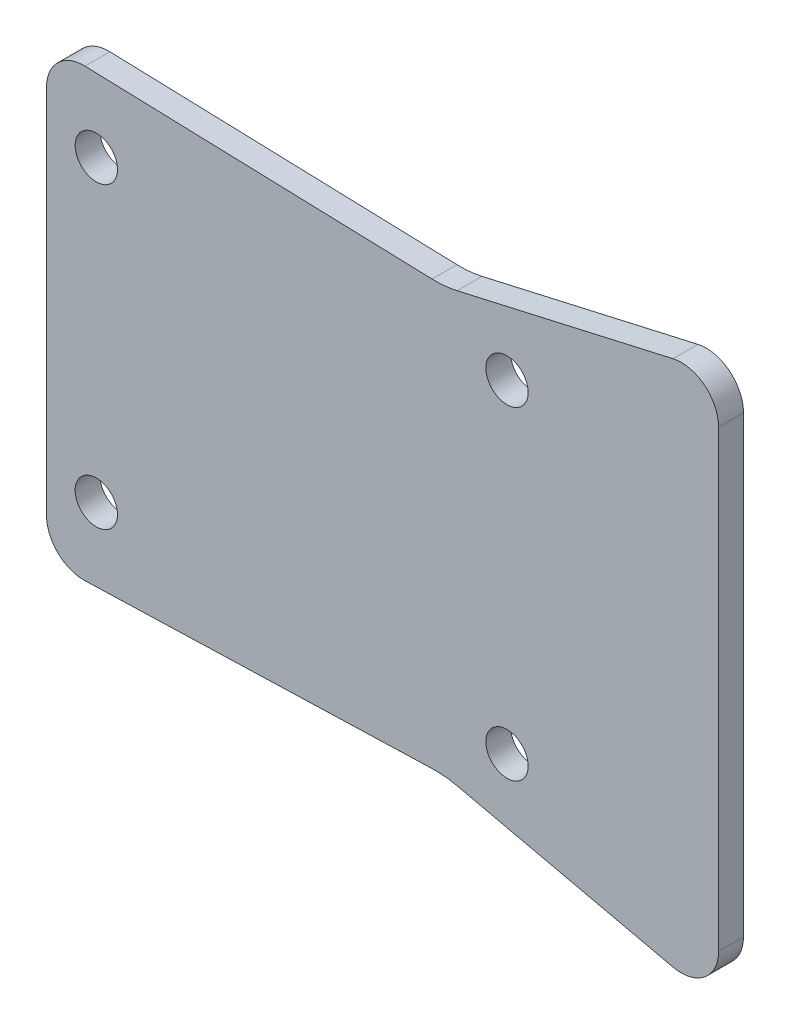
ISO-10303-21;
HEADER;
FILE_DESCRIPTION(('STEP AP214'),'2;1');
FILE_NAME('part.step','',(''),(''),'','','');
FILE_SCHEMA(('AUTOMOTIVE_DESIGN { 1 0 10303 214 1 1 1 1 }'));
ENDSEC;
DATA;
#1=APPLICATION_CONTEXT('core data for automotive mechanical design processes');
#2=APPLICATION_PROTOCOL_DEFINITION('international standard','automotive_design',2000,#1);
#3=PRODUCT_CONTEXT('',#1,'mechanical');
#4=PRODUCT('Part','Part','',(#3));
#5=PRODUCT_RELATED_PRODUCT_CATEGORY('part','',(#4));
#6=PRODUCT_DEFINITION_FORMATION('','',#4);
#7=PRODUCT_DEFINITION_CONTEXT('part definition',#1,'design');
#8=PRODUCT_DEFINITION('design','',#6,#7);
#9=PRODUCT_DEFINITION_SHAPE('','',#8);
#10=(LENGTH_UNIT() NAMED_UNIT(*) SI_UNIT(.MILLI.,.METRE.));
#11=(NAMED_UNIT(*) PLANE_ANGLE_UNIT() SI_UNIT($,.RADIAN.));
#12=(NAMED_UNIT(*) SI_UNIT($,.STERADIAN.) SOLID_ANGLE_UNIT());
#13=UNCERTAINTY_MEASURE_WITH_UNIT(LENGTH_MEASURE(1.E-05),#10,'distance_accuracy_value','');
#14=(GEOMETRIC_REPRESENTATION_CONTEXT(3) GLOBAL_UNCERTAINTY_ASSIGNED_CONTEXT((#13)) GLOBAL_UNIT_ASSIGNED_CONTEXT((#10,
#11,#12)) REPRESENTATION_CONTEXT('',''));
#15=CARTESIAN_POINT('',(0.,0.,0.));
#16=DIRECTION('',(0.,0.,1.));
#17=DIRECTION('',(1.,0.,0.));
#18=AXIS2_PLACEMENT_3D('',#15,#16,#17);
#19=CARTESIAN_POINT('',(41.,-14.9047855137033,2.));
#20=DIRECTION('',(0.,0.,-1.));
#21=DIRECTION('',(-1.,0.,0.));
#22=AXIS2_PLACEMENT_3D('',#19,#20,#21);
#23=CYLINDRICAL_SURFACE('',#22,3.00000000000001);
#24=CARTESIAN_POINT('',(41.,-14.9047855137033,0.));
#25=DIRECTION('',(0.,0.,1.));
#26=DIRECTION('',(1.,0.,0.));
#27=AXIS2_PLACEMENT_3D('',#24,#25,#26);
#28=CIRCLE('',#27,3.00000000000001);
#29=CARTESIAN_POINT('',(38.,-14.9047855137034,0.));
#30=VERTEX_POINT('',#29);
#31=CARTESIAN_POINT('',(41.0937042571332,-17.9033217419646,0.));
#32=VERTEX_POINT('',#31);
#33=EDGE_CURVE('E161',#30,#32,#28,.T.);
#34=ORIENTED_EDGE('',*,*,#33,.T.);
#35=DIRECTION('',(0.,0.,-1.));
#36=VECTOR('',#35,1.);
#37=CARTESIAN_POINT('',(41.0937042571332,-17.9033217419646,2.));
#38=LINE('',#37,#36);
#39=CARTESIAN_POINT('',(41.0937042571332,-17.9033217419646,2.));
#40=VERTEX_POINT('',#39);
#41=EDGE_CURVE('E11',#40,#32,#38,.T.);
#42=ORIENTED_EDGE('',*,*,#41,.F.);
#43=CARTESIAN_POINT('',(41.,-14.9047855137033,2.));
#44=DIRECTION('',(0.,0.,1.));
#45=DIRECTION('',(1.,0.,0.));
#46=AXIS2_PLACEMENT_3D('',#43,#44,#45);
#47=CIRCLE('',#46,3.00000000000001);
#48=CARTESIAN_POINT('',(38.,-14.9047855137034,2.));
#49=VERTEX_POINT('',#48);
#50=EDGE_CURVE('E184',#49,#40,#47,.T.);
#51=ORIENTED_EDGE('',*,*,#50,.F.);
#52=DIRECTION('',(0.,0.,-1.));
#53=VECTOR('',#52,1.);
#54=CARTESIAN_POINT('',(38.,-14.9047855137034,2.));
#55=LINE('',#54,#53);
#56=EDGE_CURVE('E157',#49,#30,#55,.T.);
#57=ORIENTED_EDGE('',*,*,#56,.T.);
#58=EDGE_LOOP('',(#34,#42,#51,#57));
#59=FACE_BOUND('',#58,.T.);
#60=ADVANCED_FACE('F41',(#59),#23,.T.);
#61=CARTESIAN_POINT('',(41.0937042571332,-17.9033217419646,2.));
#62=DIRECTION('',(-0.0312347523777213,0.999512076087079,0.));
#63=DIRECTION('',(-0.999512076087079,-0.0312347523777213,0.));
#64=AXIS2_PLACEMENT_3D('',#61,#62,#63);
#65=PLANE('',#64);
#66=DIRECTION('',(0.999512076087079,0.0312347523777213,0.));
#67=VECTOR('',#66,1.);
#68=CARTESIAN_POINT('',(41.0937042571332,-17.9033217419646,0.));
#69=LINE('',#68,#67);
#70=CARTESIAN_POINT('',(68.9760894124591,-17.0319972058607,0.));
#71=VERTEX_POINT('',#70);
#72=EDGE_CURVE('E164',#32,#71,#69,.T.);
#73=ORIENTED_EDGE('',*,*,#72,.T.);
#74=DIRECTION('',(0.,0.,-1.));
#75=VECTOR('',#74,1.);
#76=CARTESIAN_POINT('',(68.9760894124591,-17.0319972058607,2.));
#77=LINE('',#76,#75);
#78=CARTESIAN_POINT('',(68.9760894124591,-17.0319972058607,2.));
#79=VERTEX_POINT('',#78);
#80=EDGE_CURVE('E49',#79,#71,#77,.T.);
#81=ORIENTED_EDGE('',*,*,#80,.F.);
#82=DIRECTION('',(0.999512076087079,0.0312347523777213,0.));
#83=VECTOR('',#82,1.);
#84=CARTESIAN_POINT('',(41.0937042571332,-17.9033217419646,2.));
#85=LINE('',#84,#83);
#86=EDGE_CURVE('E112',#40,#79,#85,.T.);
#87=ORIENTED_EDGE('',*,*,#86,.F.);
#88=ORIENTED_EDGE('',*,*,#41,.T.);
#89=EDGE_LOOP('',(#73,#81,#87,#88));
#90=FACE_BOUND('',#89,.T.);
#91=ADVANCED_FACE('F263',(#90),#65,.F.);
#92=CARTESIAN_POINT('',(69.2259674314809,-25.0280938145575,2.));
#93=DIRECTION('',(0.,0.,-1.));
#94=DIRECTION('',(-1.,0.,0.));
#95=AXIS2_PLACEMENT_3D('',#92,#93,#94);
#96=CYLINDRICAL_SURFACE('',#95,8.0000000000002);
#97=CARTESIAN_POINT('',(69.2259674314809,-25.0280938145575,0.));
#98=DIRECTION('',(0.,0.,-1.));
#99=DIRECTION('',(-1.,0.,0.));
#100=AXIS2_PLACEMENT_3D('',#97,#98,#99);
#101=CIRCLE('',#100,8.0000000000002);
#102=CARTESIAN_POINT('',(70.9989362601927,-17.2270309682256,0.));
#103=VERTEX_POINT('',#102);
#104=EDGE_CURVE('E167',#71,#103,#101,.T.);
#105=ORIENTED_EDGE('',*,*,#104,.T.);
#106=DIRECTION('',(0.,0.,-1.));
#107=VECTOR('',#106,1.);
#108=CARTESIAN_POINT('',(70.9989362601927,-17.2270309682256,2.));
#109=LINE('',#108,#107);
#110=CARTESIAN_POINT('',(70.9989362601927,-17.2270309682256,2.));
#111=VERTEX_POINT('',#110);
#112=EDGE_CURVE('E203',#111,#103,#109,.T.);
#113=ORIENTED_EDGE('',*,*,#112,.F.);
#114=CARTESIAN_POINT('',(69.2259674314809,-25.0280938145575,2.));
#115=DIRECTION('',(0.,0.,-1.));
#116=DIRECTION('',(-1.,0.,0.));
#117=AXIS2_PLACEMENT_3D('',#114,#115,#116);
#118=CIRCLE('',#117,8.0000000000002);
#119=EDGE_CURVE('E211',#79,#111,#118,.T.);
#120=ORIENTED_EDGE('',*,*,#119,.F.);
#121=ORIENTED_EDGE('',*,*,#80,.T.);
#122=EDGE_LOOP('',(#105,#113,#120,#121));
#123=FACE_BOUND('',#122,.T.);
#124=ADVANCED_FACE('F209',(#123),#96,.F.);
#125=CARTESIAN_POINT('',(70.9989362601927,-17.2270309682256,2.));
#126=DIRECTION('',(0.221621103588968,0.97513285579146,0.));
#127=DIRECTION('',(-0.97513285579146,0.221621103588968,0.));
#128=AXIS2_PLACEMENT_3D('',#125,#126,#127);
#129=PLANE('',#128);
#130=DIRECTION('',(0.97513285579146,-0.221621103588968,0.));
#131=VECTOR('',#130,1.);
#132=CARTESIAN_POINT('',(70.9989362601927,-17.2270309682256,0.));
#133=LINE('',#132,#131);
#134=CARTESIAN_POINT('',(88.3351366892331,-21.1670765202802,0.));
#135=VERTEX_POINT('',#134);
#136=EDGE_CURVE('E169',#103,#135,#133,.T.);
#137=ORIENTED_EDGE('',*,*,#136,.T.);
#138=DIRECTION('',(0.,0.,-1.));
#139=VECTOR('',#138,1.);
#140=CARTESIAN_POINT('',(88.3351366892331,-21.1670765202802,2.));
#141=LINE('',#140,#139);
#142=CARTESIAN_POINT('',(88.3351366892331,-21.1670765202802,2.));
#143=VERTEX_POINT('',#142);
#144=EDGE_CURVE('E200',#143,#135,#141,.T.);
#145=ORIENTED_EDGE('',*,*,#144,.F.);
#146=DIRECTION('',(0.97513285579146,-0.221621103588968,0.));
#147=VECTOR('',#146,1.);
#148=CARTESIAN_POINT('',(70.9989362601927,-17.2270309682256,2.));
#149=LINE('',#148,#147);
#150=EDGE_CURVE('E229',#111,#143,#149,.T.);
#151=ORIENTED_EDGE('',*,*,#150,.F.);
#152=ORIENTED_EDGE('',*,*,#112,.T.);
#153=EDGE_LOOP('',(#137,#145,#151,#152));
#154=FACE_BOUND('',#153,.T.);
#155=ADVANCED_FACE('F220',(#154),#129,.F.);
#156=CARTESIAN_POINT('',(89.,-18.2416779529059,2.));
#157=DIRECTION('',(0.,0.,-1.));
#158=DIRECTION('',(-1.,0.,0.));
#159=AXIS2_PLACEMENT_3D('',#156,#157,#158);
#160=CYLINDRICAL_SURFACE('',#159,2.99999999999999);
#161=CARTESIAN_POINT('',(89.,-18.2416779529059,0.));
#162=DIRECTION('',(0.,0.,1.));
#163=DIRECTION('',(1.,0.,0.));
#164=AXIS2_PLACEMENT_3D('',#161,#162,#163);
#165=CIRCLE('',#164,2.99999999999999);
#166=CARTESIAN_POINT('',(92.,-18.2416779529059,0.));
#167=VERTEX_POINT('',#166);
#168=EDGE_CURVE('E171',#135,#167,#165,.T.);
#169=ORIENTED_EDGE('',*,*,#168,.T.);
#170=DIRECTION('',(0.,0.,-1.));
#171=VECTOR('',#170,1.);
#172=CARTESIAN_POINT('',(92.,-18.2416779529059,2.));
#173=LINE('',#172,#171);
#174=CARTESIAN_POINT('',(92.,-18.2416779529059,2.));
#175=VERTEX_POINT('',#174);
#176=EDGE_CURVE('E197',#175,#167,#173,.T.);
#177=ORIENTED_EDGE('',*,*,#176,.F.);
#178=CARTESIAN_POINT('',(89.,-18.2416779529059,2.));
#179=DIRECTION('',(0.,0.,1.));
#180=DIRECTION('',(1.,0.,0.));
#181=AXIS2_PLACEMENT_3D('',#178,#179,#180);
#182=CIRCLE('',#181,2.99999999999999);
#183=EDGE_CURVE('E226',#143,#175,#182,.T.);
#184=ORIENTED_EDGE('',*,*,#183,.F.);
#185=ORIENTED_EDGE('',*,*,#144,.T.);
#186=EDGE_LOOP('',(#169,#177,#184,#185));
#187=FACE_BOUND('',#186,.T.);
#188=ADVANCED_FACE('F224',(#187),#160,.T.);
#189=CARTESIAN_POINT('',(92.,-18.2416779529059,2.));
#190=DIRECTION('',(-1.,0.,0.));
#191=DIRECTION('',(0.,0.,1.));
#192=AXIS2_PLACEMENT_3D('',#189,#190,#191);
#193=PLANE('',#192);
#194=DIRECTION('',(0.,1.,0.));
#195=VECTOR('',#194,1.);
#196=CARTESIAN_POINT('',(92.,-18.2416779529059,0.));
#197=LINE('',#196,#195);
#198=CARTESIAN_POINT('',(92.,18.2416779529059,0.));
#199=VERTEX_POINT('',#198);
#200=EDGE_CURVE('E173',#167,#199,#197,.T.);
#201=ORIENTED_EDGE('',*,*,#200,.T.);
#202=DIRECTION('',(0.,0.,-1.));
#203=VECTOR('',#202,1.);
#204=CARTESIAN_POINT('',(92.,18.2416779529059,2.));
#205=LINE('',#204,#203);
#206=CARTESIAN_POINT('',(92.,18.2416779529059,2.));
#207=VERTEX_POINT('',#206);
#208=EDGE_CURVE('E194',#207,#199,#205,.T.);
#209=ORIENTED_EDGE('',*,*,#208,.F.);
#210=DIRECTION('',(0.,1.,0.));
#211=VECTOR('',#210,1.);
#212=CARTESIAN_POINT('',(92.,-18.2416779529059,2.));
#213=LINE('',#212,#211);
#214=EDGE_CURVE('E228',#175,#207,#213,.T.);
#215=ORIENTED_EDGE('',*,*,#214,.F.);
#216=ORIENTED_EDGE('',*,*,#176,.T.);
#217=EDGE_LOOP('',(#201,#209,#215,#216));
#218=FACE_BOUND('',#217,.T.);
#219=ADVANCED_FACE('F276',(#218),#193,.F.);
#220=CARTESIAN_POINT('',(89.,18.2416779529059,2.));
#221=DIRECTION('',(0.,0.,-1.));
#222=DIRECTION('',(-1.,0.,0.));
#223=AXIS2_PLACEMENT_3D('',#220,#221,#222);
#224=CYLINDRICAL_SURFACE('',#223,2.99999999999999);
#225=CARTESIAN_POINT('',(89.,18.2416779529059,0.));
#226=DIRECTION('',(0.,0.,1.));
#227=DIRECTION('',(1.,0.,0.));
#228=AXIS2_PLACEMENT_3D('',#225,#226,#227);
#229=CIRCLE('',#228,2.99999999999999);
#230=CARTESIAN_POINT('',(88.3351366892331,21.1670765202802,0.));
#231=VERTEX_POINT('',#230);
#232=EDGE_CURVE('E175',#199,#231,#229,.T.);
#233=ORIENTED_EDGE('',*,*,#232,.T.);
#234=DIRECTION('',(0.,0.,-1.));
#235=VECTOR('',#234,1.);
#236=CARTESIAN_POINT('',(88.3351366892331,21.1670765202802,2.));
#237=LINE('',#236,#235);
#238=CARTESIAN_POINT('',(88.3351366892331,21.1670765202802,2.));
#239=VERTEX_POINT('',#238);
#240=EDGE_CURVE('E191',#239,#231,#237,.T.);
#241=ORIENTED_EDGE('',*,*,#240,.F.);
#242=CARTESIAN_POINT('',(89.,18.2416779529059,2.));
#243=DIRECTION('',(0.,0.,1.));
#244=DIRECTION('',(1.,0.,0.));
#245=AXIS2_PLACEMENT_3D('',#242,#243,#244);
#246=CIRCLE('',#245,2.99999999999999);
#247=EDGE_CURVE('E231',#207,#239,#246,.T.);
#248=ORIENTED_EDGE('',*,*,#247,.F.);
#249=ORIENTED_EDGE('',*,*,#208,.T.);
#250=EDGE_LOOP('',(#233,#241,#248,#249));
#251=FACE_BOUND('',#250,.T.);
#252=ADVANCED_FACE('F279',(#251),#224,.T.);
#253=CARTESIAN_POINT('',(88.3351366892331,21.1670765202802,2.));
#254=DIRECTION('',(0.221621103588968,-0.97513285579146,0.));
#255=DIRECTION('',(0.97513285579146,0.221621103588968,0.));
#256=AXIS2_PLACEMENT_3D('',#253,#254,#255);
#257=PLANE('',#256);
#258=DIRECTION('',(-0.97513285579146,-0.221621103588968,0.));
#259=VECTOR('',#258,1.);
#260=CARTESIAN_POINT('',(88.3351366892331,21.1670765202802,0.));
#261=LINE('',#260,#259);
#262=CARTESIAN_POINT('',(70.9989362601927,17.2270309682256,0.));
#263=VERTEX_POINT('',#262);
#264=EDGE_CURVE('E177',#231,#263,#261,.T.);
#265=ORIENTED_EDGE('',*,*,#264,.T.);
#266=DIRECTION('',(0.,0.,-1.));
#267=VECTOR('',#266,1.);
#268=CARTESIAN_POINT('',(70.9989362601927,17.2270309682256,2.));
#269=LINE('',#268,#267);
#270=CARTESIAN_POINT('',(70.9989362601927,17.2270309682256,2.));
#271=VERTEX_POINT('',#270);
#272=EDGE_CURVE('E188',#271,#263,#269,.T.);
#273=ORIENTED_EDGE('',*,*,#272,.F.);
#274=DIRECTION('',(-0.97513285579146,-0.221621103588968,0.));
#275=VECTOR('',#274,1.);
#276=CARTESIAN_POINT('',(88.3351366892331,21.1670765202802,2.));
#277=LINE('',#276,#275);
#278=EDGE_CURVE('E237',#239,#271,#277,.T.);
#279=ORIENTED_EDGE('',*,*,#278,.F.);
#280=ORIENTED_EDGE('',*,*,#240,.T.);
#281=EDGE_LOOP('',(#265,#273,#279,#280));
#282=FACE_BOUND('',#281,.T.);
#283=ADVANCED_FACE('F243',(#282),#257,.F.);
#284=CARTESIAN_POINT('',(69.2259674314809,25.0280938145575,2.));
#285=DIRECTION('',(0.,0.,-1.));
#286=DIRECTION('',(-1.,0.,0.));
#287=AXIS2_PLACEMENT_3D('',#284,#285,#286);
#288=CYLINDRICAL_SURFACE('',#287,8.0000000000002);
#289=CARTESIAN_POINT('',(69.2259674314809,25.0280938145575,0.));
#290=DIRECTION('',(0.,0.,-1.));
#291=DIRECTION('',(-1.,0.,0.));
#292=AXIS2_PLACEMENT_3D('',#289,#290,#291);
#293=CIRCLE('',#292,8.0000000000002);
#294=CARTESIAN_POINT('',(68.9760894124591,17.0319972058607,0.));
#295=VERTEX_POINT('',#294);
#296=EDGE_CURVE('E179',#263,#295,#293,.T.);
#297=ORIENTED_EDGE('',*,*,#296,.T.);
#298=DIRECTION('',(0.,0.,-1.));
#299=VECTOR('',#298,1.);
#300=CARTESIAN_POINT('',(68.9760894124591,17.0319972058607,2.));
#301=LINE('',#300,#299);
#302=CARTESIAN_POINT('',(68.9760894124591,17.0319972058607,2.));
#303=VERTEX_POINT('',#302);
#304=EDGE_CURVE('E152',#303,#295,#301,.T.);
#305=ORIENTED_EDGE('',*,*,#304,.F.);
#306=CARTESIAN_POINT('',(69.2259674314809,25.0280938145575,2.));
#307=DIRECTION('',(0.,0.,-1.));
#308=DIRECTION('',(-1.,0.,0.));
#309=AXIS2_PLACEMENT_3D('',#306,#307,#308);
#310=CIRCLE('',#309,8.0000000000002);
#311=EDGE_CURVE('E143',#271,#303,#310,.T.);
#312=ORIENTED_EDGE('',*,*,#311,.F.);
#313=ORIENTED_EDGE('',*,*,#272,.T.);
#314=EDGE_LOOP('',(#297,#305,#312,#313));
#315=FACE_BOUND('',#314,.T.);
#316=ADVANCED_FACE('F247',(#315),#288,.F.);
#317=CARTESIAN_POINT('',(68.9760894124591,17.0319972058607,2.));
#318=DIRECTION('',(-0.0312347523777213,-0.999512076087079,0.));
#319=DIRECTION('',(0.999512076087079,-0.0312347523777213,0.));
#320=AXIS2_PLACEMENT_3D('',#317,#318,#319);
#321=PLANE('',#320);
#322=DIRECTION('',(-0.999512076087079,0.0312347523777213,0.));
#323=VECTOR('',#322,1.);
#324=CARTESIAN_POINT('',(68.9760894124591,17.0319972058607,0.));
#325=LINE('',#324,#323);
#326=CARTESIAN_POINT('',(41.0937042571332,17.9033217419646,0.));
#327=VERTEX_POINT('',#326);
#328=EDGE_CURVE('E151',#295,#327,#325,.T.);
#329=ORIENTED_EDGE('',*,*,#328,.T.);
#330=DIRECTION('',(0.,0.,-1.));
#331=VECTOR('',#330,1.);
#332=CARTESIAN_POINT('',(41.0937042571332,17.9033217419646,2.));
#333=LINE('',#332,#331);
#334=CARTESIAN_POINT('',(41.0937042571332,17.9033217419646,2.));
#335=VERTEX_POINT('',#334);
#336=EDGE_CURVE('E148',#335,#327,#333,.T.);
#337=ORIENTED_EDGE('',*,*,#336,.F.);
#338=DIRECTION('',(-0.999512076087079,0.0312347523777213,0.));
#339=VECTOR('',#338,1.);
#340=CARTESIAN_POINT('',(68.9760894124591,17.0319972058607,2.));
#341=LINE('',#340,#339);
#342=EDGE_CURVE('E137',#303,#335,#341,.T.);
#343=ORIENTED_EDGE('',*,*,#342,.F.);
#344=ORIENTED_EDGE('',*,*,#304,.T.);
#345=EDGE_LOOP('',(#329,#337,#343,#344));
#346=FACE_BOUND('',#345,.T.);
#347=ADVANCED_FACE('F149',(#346),#321,.F.);
#348=CARTESIAN_POINT('',(41.,14.9047855137033,2.));
#349=DIRECTION('',(0.,0.,-1.));
#350=DIRECTION('',(-1.,0.,0.));
#351=AXIS2_PLACEMENT_3D('',#348,#349,#350);
#352=CYLINDRICAL_SURFACE('',#351,3.00000000000001);
#353=CARTESIAN_POINT('',(41.,14.9047855137033,0.));
#354=DIRECTION('',(0.,0.,1.));
#355=DIRECTION('',(1.,0.,0.));
#356=AXIS2_PLACEMENT_3D('',#353,#354,#355);
#357=CIRCLE('',#356,3.00000000000001);
#358=CARTESIAN_POINT('',(38.,14.9047855137034,0.));
#359=VERTEX_POINT('',#358);
#360=EDGE_CURVE('E98',#327,#359,#357,.T.);
#361=ORIENTED_EDGE('',*,*,#360,.T.);
#362=DIRECTION('',(0.,0.,-1.));
#363=VECTOR('',#362,1.);
#364=CARTESIAN_POINT('',(38.,14.9047855137034,2.));
#365=LINE('',#364,#363);
#366=CARTESIAN_POINT('',(38.,14.9047855137034,2.));
#367=VERTEX_POINT('',#366);
#368=EDGE_CURVE('E153',#367,#359,#365,.T.);
#369=ORIENTED_EDGE('',*,*,#368,.F.);
#370=CARTESIAN_POINT('',(41.,14.9047855137033,2.));
#371=DIRECTION('',(0.,0.,1.));
#372=DIRECTION('',(1.,0.,0.));
#373=AXIS2_PLACEMENT_3D('',#370,#371,#372);
#374=CIRCLE('',#373,3.00000000000001);
#375=EDGE_CURVE('E141',#335,#367,#374,.T.);
#376=ORIENTED_EDGE('',*,*,#375,.F.);
#377=ORIENTED_EDGE('',*,*,#336,.T.);
#378=EDGE_LOOP('',(#361,#369,#376,#377));
#379=FACE_BOUND('',#378,.T.);
#380=ADVANCED_FACE('F155',(#379),#352,.T.);
#381=CARTESIAN_POINT('',(38.,14.9047855137034,2.));
#382=DIRECTION('',(1.,0.,0.));
#383=DIRECTION('',(0.,0.,-1.));
#384=AXIS2_PLACEMENT_3D('',#381,#382,#383);
#385=PLANE('',#384);
#386=DIRECTION('',(0.,-1.,0.));
#387=VECTOR('',#386,1.);
#388=CARTESIAN_POINT('',(38.,14.9047855137034,0.));
#389=LINE('',#388,#387);
#390=EDGE_CURVE('E104',#359,#30,#389,.T.);
#391=ORIENTED_EDGE('',*,*,#390,.T.);
#392=ORIENTED_EDGE('',*,*,#56,.F.);
#393=DIRECTION('',(0.,-1.,0.));
#394=VECTOR('',#393,1.);
#395=CARTESIAN_POINT('',(38.,14.9047855137034,2.));
#396=LINE('',#395,#394);
#397=EDGE_CURVE('E57',#367,#49,#396,.T.);
#398=ORIENTED_EDGE('',*,*,#397,.F.);
#399=ORIENTED_EDGE('',*,*,#368,.T.);
#400=EDGE_LOOP('',(#391,#392,#398,#399));
#401=FACE_BOUND('',#400,.T.);
#402=ADVANCED_FACE('F251',(#401),#385,.F.);
#403=CARTESIAN_POINT('',(41.,-14.9047855137033,2.));
#404=DIRECTION('',(0.,0.,1.));
#405=DIRECTION('',(1.,0.,0.));
#406=AXIS2_PLACEMENT_3D('',#403,#404,#405);
#407=PLANE('',#406);
#408=CARTESIAN_POINT('',(42.,12.,2.));
#409=DIRECTION('',(0.,0.,1.));
#410=DIRECTION('',(1.,0.,0.));
#411=AXIS2_PLACEMENT_3D('',#408,#409,#410);
#412=CIRCLE('',#411,1.7);
#413=CARTESIAN_POINT('',(43.7,12.,2.));
#414=VERTEX_POINT('',#413);
#415=EDGE_CURVE('E366',#414,#414,#412,.T.);
#416=ORIENTED_EDGE('',*,*,#415,.F.);
#417=EDGE_LOOP('',(#416));
#418=FACE_BOUND('',#417,.T.);
#419=CARTESIAN_POINT('',(75.,-13.,2.));
#420=DIRECTION('',(0.,0.,1.));
#421=DIRECTION('',(1.,0.,0.));
#422=AXIS2_PLACEMENT_3D('',#419,#420,#421);
#423=CIRCLE('',#422,1.69999999999999);
#424=CARTESIAN_POINT('',(76.7,-13.,2.));
#425=VERTEX_POINT('',#424);
#426=EDGE_CURVE('E371',#425,#425,#423,.T.);
#427=ORIENTED_EDGE('',*,*,#426,.F.);
#428=EDGE_LOOP('',(#427));
#429=FACE_BOUND('',#428,.T.);
#430=CARTESIAN_POINT('',(75.,13.,2.));
#431=DIRECTION('',(0.,0.,1.));
#432=DIRECTION('',(1.,0.,0.));
#433=AXIS2_PLACEMENT_3D('',#430,#431,#432);
#434=CIRCLE('',#433,1.69999999999999);
#435=CARTESIAN_POINT('',(76.7,13.,2.));
#436=VERTEX_POINT('',#435);
#437=EDGE_CURVE('E382',#436,#436,#434,.T.);
#438=ORIENTED_EDGE('',*,*,#437,.F.);
#439=EDGE_LOOP('',(#438));
#440=FACE_BOUND('',#439,.T.);
#441=CARTESIAN_POINT('',(42.,-12.,2.));
#442=DIRECTION('',(0.,0.,1.));
#443=DIRECTION('',(1.,0.,0.));
#444=AXIS2_PLACEMENT_3D('',#441,#442,#443);
#445=CIRCLE('',#444,1.7);
#446=CARTESIAN_POINT('',(43.7,-12.,2.));
#447=VERTEX_POINT('',#446);
#448=EDGE_CURVE('E367',#447,#447,#445,.T.);
#449=ORIENTED_EDGE('',*,*,#448,.F.);
#450=EDGE_LOOP('',(#449));
#451=FACE_BOUND('',#450,.T.);
#452=ORIENTED_EDGE('',*,*,#50,.T.);
#453=ORIENTED_EDGE('',*,*,#86,.T.);
#454=ORIENTED_EDGE('',*,*,#119,.T.);
#455=ORIENTED_EDGE('',*,*,#150,.T.);
#456=ORIENTED_EDGE('',*,*,#183,.T.);
#457=ORIENTED_EDGE('',*,*,#214,.T.);
#458=ORIENTED_EDGE('',*,*,#247,.T.);
#459=ORIENTED_EDGE('',*,*,#278,.T.);
#460=ORIENTED_EDGE('',*,*,#311,.T.);
#461=ORIENTED_EDGE('',*,*,#342,.T.);
#462=ORIENTED_EDGE('',*,*,#375,.T.);
#463=ORIENTED_EDGE('',*,*,#397,.T.);
#464=EDGE_LOOP('',(#452,#453,#454,#455,#456,#457,#458,#459,#460,#461,#462,#463));
#465=FACE_BOUND('',#464,.T.);
#466=ADVANCED_FACE('F139',(#418,#429,#440,#451,#465),#407,.T.);
#467=CARTESIAN_POINT('',(41.,-14.9047855137033,0.));
#468=DIRECTION('',(0.,0.,1.));
#469=DIRECTION('',(1.,0.,0.));
#470=AXIS2_PLACEMENT_3D('',#467,#468,#469);
#471=PLANE('',#470);
#472=CARTESIAN_POINT('',(42.,12.,0.));
#473=DIRECTION('',(0.,0.,1.));
#474=DIRECTION('',(1.,0.,0.));
#475=AXIS2_PLACEMENT_3D('',#472,#473,#474);
#476=CIRCLE('',#475,1.7);
#477=CARTESIAN_POINT('',(43.7,12.,0.));
#478=VERTEX_POINT('',#477);
#479=EDGE_CURVE('E363',#478,#478,#476,.T.);
#480=ORIENTED_EDGE('',*,*,#479,.T.);
#481=EDGE_LOOP('',(#480));
#482=FACE_BOUND('',#481,.T.);
#483=CARTESIAN_POINT('',(75.,-13.,0.));
#484=DIRECTION('',(0.,0.,1.));
#485=DIRECTION('',(1.,0.,0.));
#486=AXIS2_PLACEMENT_3D('',#483,#484,#485);
#487=CIRCLE('',#486,1.69999999999999);
#488=CARTESIAN_POINT('',(76.7,-13.,0.));
#489=VERTEX_POINT('',#488);
#490=EDGE_CURVE('E379',#489,#489,#487,.T.);
#491=ORIENTED_EDGE('',*,*,#490,.T.);
#492=EDGE_LOOP('',(#491));
#493=FACE_BOUND('',#492,.T.);
#494=CARTESIAN_POINT('',(75.,13.,0.));
#495=DIRECTION('',(0.,0.,1.));
#496=DIRECTION('',(1.,0.,0.));
#497=AXIS2_PLACEMENT_3D('',#494,#495,#496);
#498=CIRCLE('',#497,1.69999999999999);
#499=CARTESIAN_POINT('',(76.7,13.,0.));
#500=VERTEX_POINT('',#499);
#501=EDGE_CURVE('E374',#500,#500,#498,.T.);
#502=ORIENTED_EDGE('',*,*,#501,.T.);
#503=EDGE_LOOP('',(#502));
#504=FACE_BOUND('',#503,.T.);
#505=CARTESIAN_POINT('',(42.,-12.,0.));
#506=DIRECTION('',(0.,0.,1.));
#507=DIRECTION('',(1.,0.,0.));
#508=AXIS2_PLACEMENT_3D('',#505,#506,#507);
#509=CIRCLE('',#508,1.7);
#510=CARTESIAN_POINT('',(43.7,-12.,0.));
#511=VERTEX_POINT('',#510);
#512=EDGE_CURVE('E165',#511,#511,#509,.T.);
#513=ORIENTED_EDGE('',*,*,#512,.T.);
#514=EDGE_LOOP('',(#513));
#515=FACE_BOUND('',#514,.T.);
#516=ORIENTED_EDGE('',*,*,#33,.F.);
#517=ORIENTED_EDGE('',*,*,#390,.F.);
#518=ORIENTED_EDGE('',*,*,#360,.F.);
#519=ORIENTED_EDGE('',*,*,#328,.F.);
#520=ORIENTED_EDGE('',*,*,#296,.F.);
#521=ORIENTED_EDGE('',*,*,#264,.F.);
#522=ORIENTED_EDGE('',*,*,#232,.F.);
#523=ORIENTED_EDGE('',*,*,#200,.F.);
#524=ORIENTED_EDGE('',*,*,#168,.F.);
#525=ORIENTED_EDGE('',*,*,#136,.F.);
#526=ORIENTED_EDGE('',*,*,#104,.F.);
#527=ORIENTED_EDGE('',*,*,#72,.F.);
#528=EDGE_LOOP('',(#516,#517,#518,#519,#520,#521,#522,#523,#524,#525,#526,#527));
#529=FACE_BOUND('',#528,.T.);
#530=ADVANCED_FACE('F215',(#482,#493,#504,#515,#529),#471,.F.);
#531=CARTESIAN_POINT('',(42.,-12.,0.));
#532=DIRECTION('',(0.,0.,1.));
#533=DIRECTION('',(1.,0.,0.));
#534=AXIS2_PLACEMENT_3D('',#531,#532,#533);
#535=CYLINDRICAL_SURFACE('',#534,1.7);
#536=ORIENTED_EDGE('',*,*,#512,.F.);
#537=EDGE_LOOP('',(#536));
#538=FACE_BOUND('',#537,.T.);
#539=ORIENTED_EDGE('',*,*,#448,.T.);
#540=EDGE_LOOP('',(#539));
#541=FACE_BOUND('',#540,.T.);
#542=ADVANCED_FACE('F318',(#538,#541),#535,.F.);
#543=CARTESIAN_POINT('',(75.,13.,0.));
#544=DIRECTION('',(0.,0.,1.));
#545=DIRECTION('',(1.,0.,0.));
#546=AXIS2_PLACEMENT_3D('',#543,#544,#545);
#547=CYLINDRICAL_SURFACE('',#546,1.69999999999999);
#548=ORIENTED_EDGE('',*,*,#501,.F.);
#549=EDGE_LOOP('',(#548));
#550=FACE_BOUND('',#549,.T.);
#551=ORIENTED_EDGE('',*,*,#437,.T.);
#552=EDGE_LOOP('',(#551));
#553=FACE_BOUND('',#552,.T.);
#554=ADVANCED_FACE('F327',(#550,#553),#547,.F.);
#555=CARTESIAN_POINT('',(75.,-13.,0.));
#556=DIRECTION('',(0.,0.,1.));
#557=DIRECTION('',(1.,0.,0.));
#558=AXIS2_PLACEMENT_3D('',#555,#556,#557);
#559=CYLINDRICAL_SURFACE('',#558,1.69999999999999);
#560=ORIENTED_EDGE('',*,*,#490,.F.);
#561=EDGE_LOOP('',(#560));
#562=FACE_BOUND('',#561,.T.);
#563=ORIENTED_EDGE('',*,*,#426,.T.);
#564=EDGE_LOOP('',(#563));
#565=FACE_BOUND('',#564,.T.);
#566=ADVANCED_FACE('F337',(#562,#565),#559,.F.);
#567=CARTESIAN_POINT('',(42.,12.,0.));
#568=DIRECTION('',(0.,0.,1.));
#569=DIRECTION('',(1.,0.,0.));
#570=AXIS2_PLACEMENT_3D('',#567,#568,#569);
#571=CYLINDRICAL_SURFACE('',#570,1.7);
#572=ORIENTED_EDGE('',*,*,#479,.F.);
#573=EDGE_LOOP('',(#572));
#574=FACE_BOUND('',#573,.T.);
#575=ORIENTED_EDGE('',*,*,#415,.T.);
#576=EDGE_LOOP('',(#575));
#577=FACE_BOUND('',#576,.T.);
#578=ADVANCED_FACE('F347',(#574,#577),#571,.F.);
#579=CLOSED_SHELL('',(#60,#91,#124,#155,#188,#219,#252,#283,#316,#347,#380,#402,#466,#530,#542,
#554,#566,#578));
#580=MANIFOLD_SOLID_BREP('B2',#579);
#581=ADVANCED_BREP_SHAPE_REPRESENTATION('',(#18,#580),#14);
#582=SHAPE_DEFINITION_REPRESENTATION(#9,#581);
ENDSEC;
END-ISO-10303-21;
